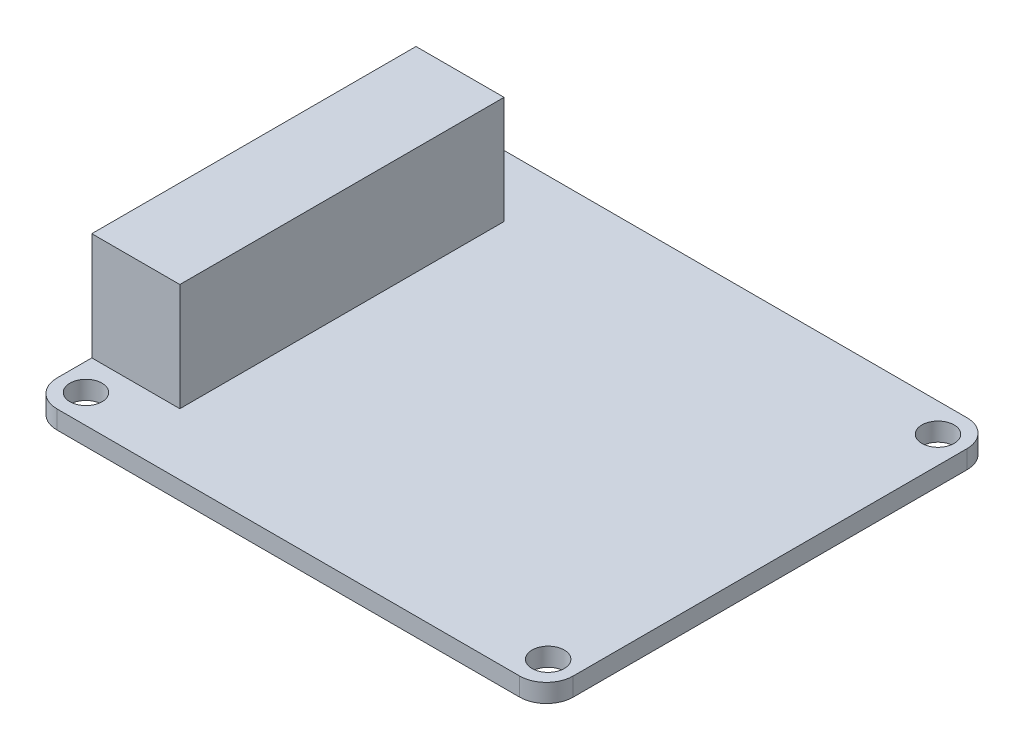
ISO-10303-21;
HEADER;
FILE_DESCRIPTION(('STEP AP214'),'2;1');
FILE_NAME('part.step','',(''),(''),'','','');
FILE_SCHEMA(('AUTOMOTIVE_DESIGN { 1 0 10303 214 1 1 1 1 }'));
ENDSEC;
DATA;
#1=APPLICATION_CONTEXT('core data for automotive mechanical design processes');
#2=APPLICATION_PROTOCOL_DEFINITION('international standard','automotive_design',2000,#1);
#3=PRODUCT_CONTEXT('',#1,'mechanical');
#4=PRODUCT('Part','Part','',(#3));
#5=PRODUCT_RELATED_PRODUCT_CATEGORY('part','',(#4));
#6=PRODUCT_DEFINITION_FORMATION('','',#4);
#7=PRODUCT_DEFINITION_CONTEXT('part definition',#1,'design');
#8=PRODUCT_DEFINITION('design','',#6,#7);
#9=PRODUCT_DEFINITION_SHAPE('','',#8);
#10=(LENGTH_UNIT() NAMED_UNIT(*) SI_UNIT(.MILLI.,.METRE.));
#11=(NAMED_UNIT(*) PLANE_ANGLE_UNIT() SI_UNIT($,.RADIAN.));
#12=(NAMED_UNIT(*) SI_UNIT($,.STERADIAN.) SOLID_ANGLE_UNIT());
#13=UNCERTAINTY_MEASURE_WITH_UNIT(LENGTH_MEASURE(1.E-05),#10,'distance_accuracy_value','');
#14=(GEOMETRIC_REPRESENTATION_CONTEXT(3) GLOBAL_UNCERTAINTY_ASSIGNED_CONTEXT((#13)) GLOBAL_UNIT_ASSIGNED_CONTEXT((#10,
#11,#12)) REPRESENTATION_CONTEXT('',''));
#15=CARTESIAN_POINT('',(0.,0.,0.));
#16=DIRECTION('',(0.,0.,1.));
#17=DIRECTION('',(1.,0.,0.));
#18=AXIS2_PLACEMENT_3D('',#15,#16,#17);
#19=CARTESIAN_POINT('',(0.,1.71,0.));
#20=DIRECTION('',(0.,-1.,0.));
#21=DIRECTION('',(0.,0.,-1.));
#22=AXIS2_PLACEMENT_3D('',#19,#20,#21);
#23=PLANE('',#22);
#24=CARTESIAN_POINT('',(-21.5457021822842,1.71,-18.1743134436496));
#25=DIRECTION('',(0.,1.,0.));
#26=DIRECTION('',(0.,0.,1.));
#27=AXIS2_PLACEMENT_3D('',#24,#25,#26);
#28=CIRCLE('',#27,1.5);
#29=CARTESIAN_POINT('',(-21.5457021822842,1.71,-16.6743134436496));
#30=VERTEX_POINT('',#29);
#31=EDGE_CURVE('E192',#30,#30,#28,.T.);
#32=ORIENTED_EDGE('',*,*,#31,.F.);
#33=EDGE_LOOP('',(#32));
#34=FACE_BOUND('',#33,.T.);
#35=CARTESIAN_POINT('',(-21.5457021822842,1.71,18.175));
#36=DIRECTION('',(0.,1.,0.));
#37=DIRECTION('',(0.,0.,1.));
#38=AXIS2_PLACEMENT_3D('',#35,#36,#37);
#39=CIRCLE('',#38,1.5);
#40=CARTESIAN_POINT('',(-21.5457021822842,1.71,19.675));
#41=VERTEX_POINT('',#40);
#42=EDGE_CURVE('E187',#41,#41,#39,.T.);
#43=ORIENTED_EDGE('',*,*,#42,.F.);
#44=EDGE_LOOP('',(#43));
#45=FACE_BOUND('',#44,.T.);
#46=CARTESIAN_POINT('',(21.5457021822842,1.71,-18.1743134436496));
#47=DIRECTION('',(0.,-1.,0.));
#48=DIRECTION('',(0.,0.,1.));
#49=AXIS2_PLACEMENT_3D('',#46,#47,#48);
#50=CIRCLE('',#49,1.5);
#51=CARTESIAN_POINT('',(21.5457021822842,1.71,-16.6743134436496));
#52=VERTEX_POINT('',#51);
#53=EDGE_CURVE('E182',#52,#52,#50,.T.);
#54=ORIENTED_EDGE('',*,*,#53,.T.);
#55=EDGE_LOOP('',(#54));
#56=FACE_BOUND('',#55,.T.);
#57=CARTESIAN_POINT('',(21.5457021822842,1.71,18.175));
#58=DIRECTION('',(0.,-1.,0.));
#59=DIRECTION('',(0.,0.,1.));
#60=AXIS2_PLACEMENT_3D('',#57,#58,#59);
#61=CIRCLE('',#60,1.5);
#62=CARTESIAN_POINT('',(21.5457021822842,1.71,19.675));
#63=VERTEX_POINT('',#62);
#64=EDGE_CURVE('E172',#63,#63,#61,.T.);
#65=ORIENTED_EDGE('',*,*,#64,.T.);
#66=EDGE_LOOP('',(#65));
#67=FACE_BOUND('',#66,.T.);
#68=DIRECTION('',(1.,0.,0.));
#69=VECTOR('',#68,1.);
#70=CARTESIAN_POINT('',(-15.855,1.71,15.115));
#71=LINE('',#70,#69);
#72=CARTESIAN_POINT('',(-24.065,1.71,15.115));
#73=VERTEX_POINT('',#72);
#74=CARTESIAN_POINT('',(-15.855,1.71,15.115));
#75=VERTEX_POINT('',#74);
#76=EDGE_CURVE('E168',#73,#75,#71,.T.);
#77=ORIENTED_EDGE('',*,*,#76,.F.);
#78=DIRECTION('',(0.,0.,1.));
#79=VECTOR('',#78,1.);
#80=CARTESIAN_POINT('',(-24.065,1.71,20.855));
#81=LINE('',#80,#79);
#82=CARTESIAN_POINT('',(-24.065,1.71,18.355));
#83=VERTEX_POINT('',#82);
#84=EDGE_CURVE('E206',#73,#83,#81,.T.);
#85=ORIENTED_EDGE('',*,*,#84,.T.);
#86=CARTESIAN_POINT('',(-21.565,1.71,18.355));
#87=DIRECTION('',(0.,-1.,0.));
#88=DIRECTION('',(0.,0.,-1.));
#89=AXIS2_PLACEMENT_3D('',#86,#87,#88);
#90=CIRCLE('',#89,2.5);
#91=CARTESIAN_POINT('',(-21.565,1.71,20.855));
#92=VERTEX_POINT('',#91);
#93=EDGE_CURVE('E264',#83,#92,#90,.F.);
#94=ORIENTED_EDGE('',*,*,#93,.T.);
#95=DIRECTION('',(1.,0.,0.));
#96=VECTOR('',#95,1.);
#97=CARTESIAN_POINT('',(-24.065,1.71,20.855));
#98=LINE('',#97,#96);
#99=CARTESIAN_POINT('',(21.565,1.71,20.855));
#100=VERTEX_POINT('',#99);
#101=EDGE_CURVE('E210',#92,#100,#98,.T.);
#102=ORIENTED_EDGE('',*,*,#101,.T.);
#103=CARTESIAN_POINT('',(21.565,1.71,18.355));
#104=DIRECTION('',(0.,-1.,0.));
#105=DIRECTION('',(0.,0.,-1.));
#106=AXIS2_PLACEMENT_3D('',#103,#104,#105);
#107=CIRCLE('',#106,2.5);
#108=CARTESIAN_POINT('',(24.065,1.71,18.355));
#109=VERTEX_POINT('',#108);
#110=EDGE_CURVE('E261',#100,#109,#107,.F.);
#111=ORIENTED_EDGE('',*,*,#110,.T.);
#112=DIRECTION('',(0.,0.,-1.));
#113=VECTOR('',#112,1.);
#114=CARTESIAN_POINT('',(24.065,1.71,20.855));
#115=LINE('',#114,#113);
#116=CARTESIAN_POINT('',(24.065,1.71,-18.355));
#117=VERTEX_POINT('',#116);
#118=EDGE_CURVE('E197',#109,#117,#115,.T.);
#119=ORIENTED_EDGE('',*,*,#118,.T.);
#120=CARTESIAN_POINT('',(21.565,1.71,-18.355));
#121=DIRECTION('',(0.,-1.,0.));
#122=DIRECTION('',(0.,0.,-1.));
#123=AXIS2_PLACEMENT_3D('',#120,#121,#122);
#124=CIRCLE('',#123,2.5);
#125=CARTESIAN_POINT('',(21.565,1.71,-20.855));
#126=VERTEX_POINT('',#125);
#127=EDGE_CURVE('E270',#117,#126,#124,.F.);
#128=ORIENTED_EDGE('',*,*,#127,.T.);
#129=DIRECTION('',(-1.,0.,0.));
#130=VECTOR('',#129,1.);
#131=CARTESIAN_POINT('',(-24.065,1.71,-20.855));
#132=LINE('',#131,#130);
#133=CARTESIAN_POINT('',(-21.565,1.71,-20.855));
#134=VERTEX_POINT('',#133);
#135=EDGE_CURVE('E201',#126,#134,#132,.T.);
#136=ORIENTED_EDGE('',*,*,#135,.T.);
#137=CARTESIAN_POINT('',(-21.565,1.71,-18.355));
#138=DIRECTION('',(0.,-1.,0.));
#139=DIRECTION('',(0.,0.,-1.));
#140=AXIS2_PLACEMENT_3D('',#137,#138,#139);
#141=CIRCLE('',#140,2.5);
#142=CARTESIAN_POINT('',(-24.065,1.71,-18.355));
#143=VERTEX_POINT('',#142);
#144=EDGE_CURVE('E267',#134,#143,#141,.F.);
#145=ORIENTED_EDGE('',*,*,#144,.T.);
#146=CARTESIAN_POINT('',(-24.065,1.71,-15.115));
#147=VERTEX_POINT('',#146);
#148=EDGE_CURVE('E207',#143,#147,#81,.T.);
#149=ORIENTED_EDGE('',*,*,#148,.T.);
#150=DIRECTION('',(-1.,0.,0.));
#151=VECTOR('',#150,1.);
#152=CARTESIAN_POINT('',(-15.855,1.71,-15.115));
#153=LINE('',#152,#151);
#154=CARTESIAN_POINT('',(-15.855,1.71,-15.115));
#155=VERTEX_POINT('',#154);
#156=EDGE_CURVE('E80',#155,#147,#153,.T.);
#157=ORIENTED_EDGE('',*,*,#156,.F.);
#158=DIRECTION('',(0.,0.,-1.));
#159=VECTOR('',#158,1.);
#160=CARTESIAN_POINT('',(-15.855,1.71,15.115));
#161=LINE('',#160,#159);
#162=EDGE_CURVE('E75',#75,#155,#161,.T.);
#163=ORIENTED_EDGE('',*,*,#162,.F.);
#164=EDGE_LOOP('',(#77,#85,#94,#102,#111,#119,#128,#136,#145,#149,#157,#163));
#165=FACE_BOUND('',#164,.T.);
#166=ADVANCED_FACE('F57',(#34,#45,#56,#67,#165),#23,.F.);
#167=CARTESIAN_POINT('',(24.065,1.71,20.855));
#168=DIRECTION('',(-1.,0.,0.));
#169=DIRECTION('',(0.,0.,1.));
#170=AXIS2_PLACEMENT_3D('',#167,#168,#169);
#171=PLANE('',#170);
#172=DIRECTION('',(0.,0.,-1.));
#173=VECTOR('',#172,1.);
#174=CARTESIAN_POINT('',(24.065,0.,20.855));
#175=LINE('',#174,#173);
#176=CARTESIAN_POINT('',(24.065,0.,18.355));
#177=VERTEX_POINT('',#176);
#178=CARTESIAN_POINT('',(24.065,0.,-18.355));
#179=VERTEX_POINT('',#178);
#180=EDGE_CURVE('E215',#177,#179,#175,.T.);
#181=ORIENTED_EDGE('',*,*,#180,.T.);
#182=DIRECTION('',(0.,-1.,0.));
#183=VECTOR('',#182,1.);
#184=CARTESIAN_POINT('',(24.065,1.71,-18.355));
#185=LINE('',#184,#183);
#186=EDGE_CURVE('E258',#179,#117,#185,.F.);
#187=ORIENTED_EDGE('',*,*,#186,.T.);
#188=ORIENTED_EDGE('',*,*,#118,.F.);
#189=DIRECTION('',(0.,-1.,0.));
#190=VECTOR('',#189,1.);
#191=CARTESIAN_POINT('',(24.065,1.71,18.355));
#192=LINE('',#191,#190);
#193=EDGE_CURVE('E254',#109,#177,#192,.T.);
#194=ORIENTED_EDGE('',*,*,#193,.T.);
#195=EDGE_LOOP('',(#181,#187,#188,#194));
#196=FACE_BOUND('',#195,.T.);
#197=ADVANCED_FACE('F298',(#196),#171,.F.);
#198=CARTESIAN_POINT('',(-24.065,1.71,-20.855));
#199=DIRECTION('',(0.,0.,1.));
#200=DIRECTION('',(1.,0.,0.));
#201=AXIS2_PLACEMENT_3D('',#198,#199,#200);
#202=PLANE('',#201);
#203=ORIENTED_EDGE('',*,*,#135,.F.);
#204=DIRECTION('',(0.,-1.,0.));
#205=VECTOR('',#204,1.);
#206=CARTESIAN_POINT('',(21.565,1.71,-20.855));
#207=LINE('',#206,#205);
#208=CARTESIAN_POINT('',(21.565,0.,-20.855));
#209=VERTEX_POINT('',#208);
#210=EDGE_CURVE('E238',#126,#209,#207,.T.);
#211=ORIENTED_EDGE('',*,*,#210,.T.);
#212=DIRECTION('',(-1.,0.,0.));
#213=VECTOR('',#212,1.);
#214=CARTESIAN_POINT('',(-24.065,0.,-20.855));
#215=LINE('',#214,#213);
#216=CARTESIAN_POINT('',(-21.565,0.,-20.855));
#217=VERTEX_POINT('',#216);
#218=EDGE_CURVE('E219',#209,#217,#215,.T.);
#219=ORIENTED_EDGE('',*,*,#218,.T.);
#220=DIRECTION('',(0.,-1.,0.));
#221=VECTOR('',#220,1.);
#222=CARTESIAN_POINT('',(-21.565,1.71,-20.855));
#223=LINE('',#222,#221);
#224=EDGE_CURVE('E214',#217,#134,#223,.F.);
#225=ORIENTED_EDGE('',*,*,#224,.T.);
#226=EDGE_LOOP('',(#203,#211,#219,#225));
#227=FACE_BOUND('',#226,.T.);
#228=ADVANCED_FACE('F337',(#227),#202,.F.);
#229=CARTESIAN_POINT('',(-24.065,1.71,20.855));
#230=DIRECTION('',(1.,0.,0.));
#231=DIRECTION('',(0.,0.,-1.));
#232=AXIS2_PLACEMENT_3D('',#229,#230,#231);
#233=PLANE('',#232);
#234=ORIENTED_EDGE('',*,*,#148,.F.);
#235=DIRECTION('',(0.,-1.,0.));
#236=VECTOR('',#235,1.);
#237=CARTESIAN_POINT('',(-24.065,1.71,-18.355));
#238=LINE('',#237,#236);
#239=CARTESIAN_POINT('',(-24.065,0.,-18.355));
#240=VERTEX_POINT('',#239);
#241=EDGE_CURVE('E277',#143,#240,#238,.T.);
#242=ORIENTED_EDGE('',*,*,#241,.T.);
#243=DIRECTION('',(0.,0.,1.));
#244=VECTOR('',#243,1.);
#245=CARTESIAN_POINT('',(-24.065,0.,20.855));
#246=LINE('',#245,#244);
#247=CARTESIAN_POINT('',(-24.065,0.,18.355));
#248=VERTEX_POINT('',#247);
#249=EDGE_CURVE('E223',#240,#248,#246,.T.);
#250=ORIENTED_EDGE('',*,*,#249,.T.);
#251=DIRECTION('',(0.,-1.,0.));
#252=VECTOR('',#251,1.);
#253=CARTESIAN_POINT('',(-24.065,1.71,18.355));
#254=LINE('',#253,#252);
#255=EDGE_CURVE('E273',#248,#83,#254,.F.);
#256=ORIENTED_EDGE('',*,*,#255,.T.);
#257=ORIENTED_EDGE('',*,*,#84,.F.);
#258=DIRECTION('',(0.,-1.,0.));
#259=VECTOR('',#258,1.);
#260=CARTESIAN_POINT('',(-24.065,11.74,15.115));
#261=LINE('',#260,#259);
#262=CARTESIAN_POINT('',(-24.065,11.74,15.115));
#263=VERTEX_POINT('',#262);
#264=EDGE_CURVE('E178',#263,#73,#261,.T.);
#265=ORIENTED_EDGE('',*,*,#264,.F.);
#266=DIRECTION('',(0.,0.,1.));
#267=VECTOR('',#266,1.);
#268=CARTESIAN_POINT('',(-24.065,11.74,15.115));
#269=LINE('',#268,#267);
#270=CARTESIAN_POINT('',(-24.065,11.74,-15.115));
#271=VERTEX_POINT('',#270);
#272=EDGE_CURVE('E157',#271,#263,#269,.T.);
#273=ORIENTED_EDGE('',*,*,#272,.F.);
#274=DIRECTION('',(0.,-1.,0.));
#275=VECTOR('',#274,1.);
#276=CARTESIAN_POINT('',(-24.065,11.74,-15.115));
#277=LINE('',#276,#275);
#278=EDGE_CURVE('E153',#271,#147,#277,.T.);
#279=ORIENTED_EDGE('',*,*,#278,.T.);
#280=EDGE_LOOP('',(#234,#242,#250,#256,#257,#265,#273,#279));
#281=FACE_BOUND('',#280,.T.);
#282=ADVANCED_FACE('F310',(#281),#233,.F.);
#283=CARTESIAN_POINT('',(-24.065,1.71,20.855));
#284=DIRECTION('',(0.,0.,-1.));
#285=DIRECTION('',(-1.,0.,0.));
#286=AXIS2_PLACEMENT_3D('',#283,#284,#285);
#287=PLANE('',#286);
#288=ORIENTED_EDGE('',*,*,#101,.F.);
#289=DIRECTION('',(0.,-1.,0.));
#290=VECTOR('',#289,1.);
#291=CARTESIAN_POINT('',(-21.565,1.71,20.855));
#292=LINE('',#291,#290);
#293=CARTESIAN_POINT('',(-21.565,0.,20.855));
#294=VERTEX_POINT('',#293);
#295=EDGE_CURVE('E12',#92,#294,#292,.T.);
#296=ORIENTED_EDGE('',*,*,#295,.T.);
#297=DIRECTION('',(1.,0.,0.));
#298=VECTOR('',#297,1.);
#299=CARTESIAN_POINT('',(-24.065,0.,20.855));
#300=LINE('',#299,#298);
#301=CARTESIAN_POINT('',(21.565,0.,20.855));
#302=VERTEX_POINT('',#301);
#303=EDGE_CURVE('E202',#294,#302,#300,.T.);
#304=ORIENTED_EDGE('',*,*,#303,.T.);
#305=DIRECTION('',(0.,-1.,0.));
#306=VECTOR('',#305,1.);
#307=CARTESIAN_POINT('',(21.565,1.71,20.855));
#308=LINE('',#307,#306);
#309=EDGE_CURVE('E67',#302,#100,#308,.F.);
#310=ORIENTED_EDGE('',*,*,#309,.T.);
#311=EDGE_LOOP('',(#288,#296,#304,#310));
#312=FACE_BOUND('',#311,.T.);
#313=ADVANCED_FACE('F353',(#312),#287,.F.);
#314=CARTESIAN_POINT('',(0.,0.,0.));
#315=DIRECTION('',(0.,-1.,0.));
#316=DIRECTION('',(0.,0.,-1.));
#317=AXIS2_PLACEMENT_3D('',#314,#315,#316);
#318=PLANE('',#317);
#319=CARTESIAN_POINT('',(21.5457021822842,0.,18.175));
#320=DIRECTION('',(0.,-1.,0.));
#321=DIRECTION('',(0.,0.,-1.));
#322=AXIS2_PLACEMENT_3D('',#319,#320,#321);
#323=CIRCLE('',#322,1.5);
#324=CARTESIAN_POINT('',(21.5457021822842,0.,16.675));
#325=VERTEX_POINT('',#324);
#326=EDGE_CURVE('E61',#325,#325,#323,.F.);
#327=ORIENTED_EDGE('',*,*,#326,.T.);
#328=EDGE_LOOP('',(#327));
#329=FACE_BOUND('',#328,.T.);
#330=CARTESIAN_POINT('',(21.5457021822842,0.,-18.1743134436496));
#331=DIRECTION('',(0.,-1.,0.));
#332=DIRECTION('',(0.,0.,-1.));
#333=AXIS2_PLACEMENT_3D('',#330,#331,#332);
#334=CIRCLE('',#333,1.5);
#335=CARTESIAN_POINT('',(21.5457021822842,0.,-19.6743134436496));
#336=VERTEX_POINT('',#335);
#337=EDGE_CURVE('E186',#336,#336,#334,.F.);
#338=ORIENTED_EDGE('',*,*,#337,.T.);
#339=EDGE_LOOP('',(#338));
#340=FACE_BOUND('',#339,.T.);
#341=CARTESIAN_POINT('',(-21.5457021822842,0.,18.175));
#342=DIRECTION('',(0.,-1.,0.));
#343=DIRECTION('',(0.,0.,-1.));
#344=AXIS2_PLACEMENT_3D('',#341,#342,#343);
#345=CIRCLE('',#344,1.5);
#346=CARTESIAN_POINT('',(-21.5457021822842,0.,16.675));
#347=VERTEX_POINT('',#346);
#348=EDGE_CURVE('E191',#347,#347,#345,.T.);
#349=ORIENTED_EDGE('',*,*,#348,.F.);
#350=EDGE_LOOP('',(#349));
#351=FACE_BOUND('',#350,.T.);
#352=CARTESIAN_POINT('',(-21.5457021822842,0.,-18.1743134436496));
#353=DIRECTION('',(0.,-1.,0.));
#354=DIRECTION('',(0.,0.,-1.));
#355=AXIS2_PLACEMENT_3D('',#352,#353,#354);
#356=CIRCLE('',#355,1.5);
#357=CARTESIAN_POINT('',(-21.5457021822842,0.,-19.6743134436496));
#358=VERTEX_POINT('',#357);
#359=EDGE_CURVE('E196',#358,#358,#356,.T.);
#360=ORIENTED_EDGE('',*,*,#359,.F.);
#361=EDGE_LOOP('',(#360));
#362=FACE_BOUND('',#361,.T.);
#363=ORIENTED_EDGE('',*,*,#218,.F.);
#364=CARTESIAN_POINT('',(21.565,0.,-18.355));
#365=DIRECTION('',(0.,-1.,0.));
#366=DIRECTION('',(0.,0.,-1.));
#367=AXIS2_PLACEMENT_3D('',#364,#365,#366);
#368=CIRCLE('',#367,2.5);
#369=EDGE_CURVE('E251',#209,#179,#368,.T.);
#370=ORIENTED_EDGE('',*,*,#369,.T.);
#371=ORIENTED_EDGE('',*,*,#180,.F.);
#372=CARTESIAN_POINT('',(21.565,0.,18.355));
#373=DIRECTION('',(0.,-1.,0.));
#374=DIRECTION('',(0.,0.,-1.));
#375=AXIS2_PLACEMENT_3D('',#372,#373,#374);
#376=CIRCLE('',#375,2.5);
#377=EDGE_CURVE('E242',#177,#302,#376,.T.);
#378=ORIENTED_EDGE('',*,*,#377,.T.);
#379=ORIENTED_EDGE('',*,*,#303,.F.);
#380=CARTESIAN_POINT('',(-21.565,0.,18.355));
#381=DIRECTION('',(0.,-1.,0.));
#382=DIRECTION('',(0.,0.,-1.));
#383=AXIS2_PLACEMENT_3D('',#380,#381,#382);
#384=CIRCLE('',#383,2.5);
#385=EDGE_CURVE('E245',#294,#248,#384,.T.);
#386=ORIENTED_EDGE('',*,*,#385,.T.);
#387=ORIENTED_EDGE('',*,*,#249,.F.);
#388=CARTESIAN_POINT('',(-21.565,0.,-18.355));
#389=DIRECTION('',(0.,-1.,0.));
#390=DIRECTION('',(0.,0.,-1.));
#391=AXIS2_PLACEMENT_3D('',#388,#389,#390);
#392=CIRCLE('',#391,2.5);
#393=EDGE_CURVE('E248',#240,#217,#392,.T.);
#394=ORIENTED_EDGE('',*,*,#393,.T.);
#395=EDGE_LOOP('',(#363,#370,#371,#378,#379,#386,#387,#394));
#396=FACE_BOUND('',#395,.T.);
#397=ADVANCED_FACE('F286',(#329,#340,#351,#362,#396),#318,.T.);
#398=CARTESIAN_POINT('',(-21.5457021822842,-9.,-18.1743134436496));
#399=DIRECTION('',(0.,1.,0.));
#400=DIRECTION('',(0.,0.,1.));
#401=AXIS2_PLACEMENT_3D('',#398,#399,#400);
#402=CYLINDRICAL_SURFACE('',#401,1.5);
#403=ORIENTED_EDGE('',*,*,#359,.T.);
#404=EDGE_LOOP('',(#403));
#405=FACE_BOUND('',#404,.T.);
#406=ORIENTED_EDGE('',*,*,#31,.T.);
#407=EDGE_LOOP('',(#406));
#408=FACE_BOUND('',#407,.T.);
#409=ADVANCED_FACE('F376',(#405,#408),#402,.F.);
#410=CARTESIAN_POINT('',(-21.5457021822842,-9.,18.175));
#411=DIRECTION('',(0.,1.,0.));
#412=DIRECTION('',(0.,0.,1.));
#413=AXIS2_PLACEMENT_3D('',#410,#411,#412);
#414=CYLINDRICAL_SURFACE('',#413,1.5);
#415=ORIENTED_EDGE('',*,*,#348,.T.);
#416=EDGE_LOOP('',(#415));
#417=FACE_BOUND('',#416,.T.);
#418=ORIENTED_EDGE('',*,*,#42,.T.);
#419=EDGE_LOOP('',(#418));
#420=FACE_BOUND('',#419,.T.);
#421=ADVANCED_FACE('F366',(#417,#420),#414,.F.);
#422=CARTESIAN_POINT('',(21.565,1.71,-18.355));
#423=DIRECTION('',(0.,-1.,0.));
#424=DIRECTION('',(0.,0.,-1.));
#425=AXIS2_PLACEMENT_3D('',#422,#423,#424);
#426=CYLINDRICAL_SURFACE('',#425,2.5);
#427=ORIENTED_EDGE('',*,*,#127,.F.);
#428=ORIENTED_EDGE('',*,*,#186,.F.);
#429=ORIENTED_EDGE('',*,*,#369,.F.);
#430=ORIENTED_EDGE('',*,*,#210,.F.);
#431=EDGE_LOOP('',(#427,#428,#429,#430));
#432=FACE_BOUND('',#431,.T.);
#433=ADVANCED_FACE('F341',(#432),#426,.T.);
#434=CARTESIAN_POINT('',(-21.565,1.71,-18.355));
#435=DIRECTION('',(0.,-1.,0.));
#436=DIRECTION('',(0.,0.,-1.));
#437=AXIS2_PLACEMENT_3D('',#434,#435,#436);
#438=CYLINDRICAL_SURFACE('',#437,2.5);
#439=ORIENTED_EDGE('',*,*,#144,.F.);
#440=ORIENTED_EDGE('',*,*,#224,.F.);
#441=ORIENTED_EDGE('',*,*,#393,.F.);
#442=ORIENTED_EDGE('',*,*,#241,.F.);
#443=EDGE_LOOP('',(#439,#440,#441,#442));
#444=FACE_BOUND('',#443,.T.);
#445=ADVANCED_FACE('F331',(#444),#438,.T.);
#446=CARTESIAN_POINT('',(-21.565,1.71,18.355));
#447=DIRECTION('',(0.,-1.,0.));
#448=DIRECTION('',(0.,0.,-1.));
#449=AXIS2_PLACEMENT_3D('',#446,#447,#448);
#450=CYLINDRICAL_SURFACE('',#449,2.5);
#451=ORIENTED_EDGE('',*,*,#93,.F.);
#452=ORIENTED_EDGE('',*,*,#255,.F.);
#453=ORIENTED_EDGE('',*,*,#385,.F.);
#454=ORIENTED_EDGE('',*,*,#295,.F.);
#455=EDGE_LOOP('',(#451,#452,#453,#454));
#456=FACE_BOUND('',#455,.T.);
#457=ADVANCED_FACE('F356',(#456),#450,.T.);
#458=CARTESIAN_POINT('',(21.565,1.71,18.355));
#459=DIRECTION('',(0.,-1.,0.));
#460=DIRECTION('',(0.,0.,-1.));
#461=AXIS2_PLACEMENT_3D('',#458,#459,#460);
#462=CYLINDRICAL_SURFACE('',#461,2.5);
#463=ORIENTED_EDGE('',*,*,#110,.F.);
#464=ORIENTED_EDGE('',*,*,#309,.F.);
#465=ORIENTED_EDGE('',*,*,#377,.F.);
#466=ORIENTED_EDGE('',*,*,#193,.F.);
#467=EDGE_LOOP('',(#463,#464,#465,#466));
#468=FACE_BOUND('',#467,.T.);
#469=ADVANCED_FACE('F59',(#468),#462,.T.);
#470=CARTESIAN_POINT('',(21.5457021822842,-9.,-18.1743134436496));
#471=DIRECTION('',(0.,1.,0.));
#472=DIRECTION('',(0.,0.,1.));
#473=AXIS2_PLACEMENT_3D('',#470,#471,#472);
#474=CYLINDRICAL_SURFACE('',#473,1.5);
#475=ORIENTED_EDGE('',*,*,#337,.F.);
#476=EDGE_LOOP('',(#475));
#477=FACE_BOUND('',#476,.T.);
#478=ORIENTED_EDGE('',*,*,#53,.F.);
#479=EDGE_LOOP('',(#478));
#480=FACE_BOUND('',#479,.T.);
#481=ADVANCED_FACE('F289',(#477,#480),#474,.F.);
#482=CARTESIAN_POINT('',(21.5457021822842,-9.,18.175));
#483=DIRECTION('',(0.,1.,0.));
#484=DIRECTION('',(0.,0.,1.));
#485=AXIS2_PLACEMENT_3D('',#482,#483,#484);
#486=CYLINDRICAL_SURFACE('',#485,1.5);
#487=ORIENTED_EDGE('',*,*,#326,.F.);
#488=EDGE_LOOP('',(#487));
#489=FACE_BOUND('',#488,.T.);
#490=ORIENTED_EDGE('',*,*,#64,.F.);
#491=EDGE_LOOP('',(#490));
#492=FACE_BOUND('',#491,.T.);
#493=ADVANCED_FACE('F292',(#489,#492),#486,.F.);
#494=CARTESIAN_POINT('',(-15.855,11.74,15.115));
#495=DIRECTION('',(-1.,0.,0.));
#496=DIRECTION('',(0.,0.,1.));
#497=AXIS2_PLACEMENT_3D('',#494,#495,#496);
#498=PLANE('',#497);
#499=ORIENTED_EDGE('',*,*,#162,.T.);
#500=DIRECTION('',(0.,-1.,0.));
#501=VECTOR('',#500,1.);
#502=CARTESIAN_POINT('',(-15.855,11.74,-15.115));
#503=LINE('',#502,#501);
#504=CARTESIAN_POINT('',(-15.855,11.74,-15.115));
#505=VERTEX_POINT('',#504);
#506=EDGE_CURVE('E151',#505,#155,#503,.T.);
#507=ORIENTED_EDGE('',*,*,#506,.F.);
#508=DIRECTION('',(0.,0.,-1.));
#509=VECTOR('',#508,1.);
#510=CARTESIAN_POINT('',(-15.855,11.74,15.115));
#511=LINE('',#510,#509);
#512=CARTESIAN_POINT('',(-15.855,11.74,15.115));
#513=VERTEX_POINT('',#512);
#514=EDGE_CURVE('E158',#513,#505,#511,.T.);
#515=ORIENTED_EDGE('',*,*,#514,.F.);
#516=DIRECTION('',(0.,-1.,0.));
#517=VECTOR('',#516,1.);
#518=CARTESIAN_POINT('',(-15.855,11.74,15.115));
#519=LINE('',#518,#517);
#520=EDGE_CURVE('E316',#513,#75,#519,.T.);
#521=ORIENTED_EDGE('',*,*,#520,.T.);
#522=EDGE_LOOP('',(#499,#507,#515,#521));
#523=FACE_BOUND('',#522,.T.);
#524=ADVANCED_FACE('F170',(#523),#498,.F.);
#525=CARTESIAN_POINT('',(-15.855,11.74,-15.115));
#526=DIRECTION('',(0.,0.,1.));
#527=DIRECTION('',(1.,0.,0.));
#528=AXIS2_PLACEMENT_3D('',#525,#526,#527);
#529=PLANE('',#528);
#530=ORIENTED_EDGE('',*,*,#156,.T.);
#531=ORIENTED_EDGE('',*,*,#278,.F.);
#532=DIRECTION('',(-1.,0.,0.));
#533=VECTOR('',#532,1.);
#534=CARTESIAN_POINT('',(-15.855,11.74,-15.115));
#535=LINE('',#534,#533);
#536=EDGE_CURVE('E147',#505,#271,#535,.T.);
#537=ORIENTED_EDGE('',*,*,#536,.F.);
#538=ORIENTED_EDGE('',*,*,#506,.T.);
#539=EDGE_LOOP('',(#530,#531,#537,#538));
#540=FACE_BOUND('',#539,.T.);
#541=ADVANCED_FACE('F149',(#540),#529,.F.);
#542=CARTESIAN_POINT('',(-15.855,11.74,15.115));
#543=DIRECTION('',(0.,0.,-1.));
#544=DIRECTION('',(-1.,0.,0.));
#545=AXIS2_PLACEMENT_3D('',#542,#543,#544);
#546=PLANE('',#545);
#547=ORIENTED_EDGE('',*,*,#76,.T.);
#548=ORIENTED_EDGE('',*,*,#520,.F.);
#549=DIRECTION('',(1.,0.,0.));
#550=VECTOR('',#549,1.);
#551=CARTESIAN_POINT('',(-15.855,11.74,15.115));
#552=LINE('',#551,#550);
#553=EDGE_CURVE('E163',#263,#513,#552,.T.);
#554=ORIENTED_EDGE('',*,*,#553,.F.);
#555=ORIENTED_EDGE('',*,*,#264,.T.);
#556=EDGE_LOOP('',(#547,#548,#554,#555));
#557=FACE_BOUND('',#556,.T.);
#558=ADVANCED_FACE('F314',(#557),#546,.F.);
#559=CARTESIAN_POINT('',(0.,11.74,0.));
#560=DIRECTION('',(0.,1.,0.));
#561=DIRECTION('',(0.,0.,1.));
#562=AXIS2_PLACEMENT_3D('',#559,#560,#561);
#563=PLANE('',#562);
#564=ORIENTED_EDGE('',*,*,#514,.T.);
#565=ORIENTED_EDGE('',*,*,#536,.T.);
#566=ORIENTED_EDGE('',*,*,#272,.T.);
#567=ORIENTED_EDGE('',*,*,#553,.T.);
#568=EDGE_LOOP('',(#564,#565,#566,#567));
#569=FACE_BOUND('',#568,.T.);
#570=ADVANCED_FACE('F161',(#569),#563,.T.);
#571=CLOSED_SHELL('',(#166,#197,#228,#282,#313,#397,#409,#421,#433,#445,#457,#469,#481,#493,
#524,#541,#558,#570));
#572=MANIFOLD_SOLID_BREP('B2',#571);
#573=ADVANCED_BREP_SHAPE_REPRESENTATION('',(#18,#572),#14);
#574=SHAPE_DEFINITION_REPRESENTATION(#9,#573);
ENDSEC;
END-ISO-10303-21;
